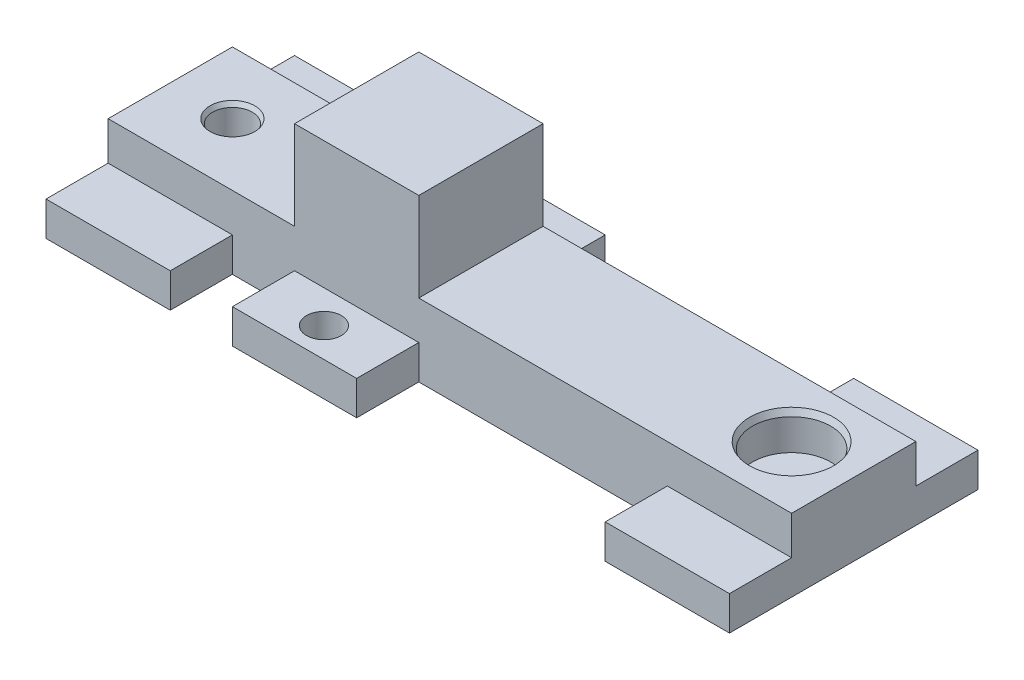
ISO-10303-21;
HEADER;
FILE_DESCRIPTION(('STEP AP214'),'2;1');
FILE_NAME('part.step','',(''),(''),'','','');
FILE_SCHEMA(('AUTOMOTIVE_DESIGN { 1 0 10303 214 1 1 1 1 }'));
ENDSEC;
DATA;
#1=APPLICATION_CONTEXT('core data for automotive mechanical design processes');
#2=APPLICATION_PROTOCOL_DEFINITION('international standard','automotive_design',2000,#1);
#3=PRODUCT_CONTEXT('',#1,'mechanical');
#4=PRODUCT('Part','Part','',(#3));
#5=PRODUCT_RELATED_PRODUCT_CATEGORY('part','',(#4));
#6=PRODUCT_DEFINITION_FORMATION('','',#4);
#7=PRODUCT_DEFINITION_CONTEXT('part definition',#1,'design');
#8=PRODUCT_DEFINITION('design','',#6,#7);
#9=PRODUCT_DEFINITION_SHAPE('','',#8);
#10=(LENGTH_UNIT() NAMED_UNIT(*) SI_UNIT(.MILLI.,.METRE.));
#11=(NAMED_UNIT(*) PLANE_ANGLE_UNIT() SI_UNIT($,.RADIAN.));
#12=(NAMED_UNIT(*) SI_UNIT($,.STERADIAN.) SOLID_ANGLE_UNIT());
#13=UNCERTAINTY_MEASURE_WITH_UNIT(LENGTH_MEASURE(1.E-05),#10,'distance_accuracy_value','');
#14=(GEOMETRIC_REPRESENTATION_CONTEXT(3) GLOBAL_UNCERTAINTY_ASSIGNED_CONTEXT((#13)) GLOBAL_UNIT_ASSIGNED_CONTEXT((#10,
#11,#12)) REPRESENTATION_CONTEXT('',''));
#15=CARTESIAN_POINT('',(0.,0.,0.));
#16=DIRECTION('',(0.,0.,1.));
#17=DIRECTION('',(1.,0.,0.));
#18=AXIS2_PLACEMENT_3D('',#15,#16,#17);
#19=CARTESIAN_POINT('',(0.,-6.5,0.));
#20=DIRECTION('',(0.,1.,0.));
#21=DIRECTION('',(0.,0.,1.));
#22=AXIS2_PLACEMENT_3D('',#19,#20,#21);
#23=PLANE('',#22);
#24=CARTESIAN_POINT('',(-15.,-6.5,0.));
#25=DIRECTION('',(0.,1.,0.));
#26=DIRECTION('',(0.,0.,1.));
#27=AXIS2_PLACEMENT_3D('',#24,#25,#26);
#28=CIRCLE('',#27,1.8);
#29=CARTESIAN_POINT('',(-15.,-6.5,1.8));
#30=VERTEX_POINT('',#29);
#31=EDGE_CURVE('E383',#30,#30,#28,.T.);
#32=ORIENTED_EDGE('',*,*,#31,.T.);
#33=EDGE_LOOP('',(#32));
#34=FACE_BOUND('',#33,.T.);
#35=CARTESIAN_POINT('',(0.,-6.5,7.63675200643376));
#36=DIRECTION('',(0.,1.,0.));
#37=DIRECTION('',(0.,0.,1.));
#38=AXIS2_PLACEMENT_3D('',#35,#36,#37);
#39=CIRCLE('',#38,1.6);
#40=CARTESIAN_POINT('',(0.,-6.5,9.23675200643376));
#41=VERTEX_POINT('',#40);
#42=EDGE_CURVE('E379',#41,#41,#39,.T.);
#43=ORIENTED_EDGE('',*,*,#42,.T.);
#44=EDGE_LOOP('',(#43));
#45=FACE_BOUND('',#44,.T.);
#46=CARTESIAN_POINT('',(0.,-6.5,-7.63675200643376));
#47=DIRECTION('',(0.,1.,0.));
#48=DIRECTION('',(0.,0.,1.));
#49=AXIS2_PLACEMENT_3D('',#46,#47,#48);
#50=CIRCLE('',#49,1.74641016151377);
#51=CARTESIAN_POINT('',(0.,-6.5,-5.89034184491999));
#52=VERTEX_POINT('',#51);
#53=EDGE_CURVE('E375',#52,#52,#50,.T.);
#54=ORIENTED_EDGE('',*,*,#53,.T.);
#55=EDGE_LOOP('',(#54));
#56=FACE_BOUND('',#55,.T.);
#57=DIRECTION('',(1.,0.,0.));
#58=VECTOR('',#57,1.);
#59=CARTESIAN_POINT('',(-20.,-6.5,10.));
#60=LINE('',#59,#58);
#61=CARTESIAN_POINT('',(-5.,-6.5,10.));
#62=VERTEX_POINT('',#61);
#63=CARTESIAN_POINT('',(5.,-6.5,10.));
#64=VERTEX_POINT('',#63);
#65=EDGE_CURVE('E244',#62,#64,#60,.T.);
#66=ORIENTED_EDGE('',*,*,#65,.F.);
#67=DIRECTION('',(0.,0.,-1.));
#68=VECTOR('',#67,1.);
#69=CARTESIAN_POINT('',(-5.,-6.5,0.));
#70=LINE('',#69,#68);
#71=CARTESIAN_POINT('',(-5.,-6.5,5.));
#72=VERTEX_POINT('',#71);
#73=EDGE_CURVE('E481',#62,#72,#70,.T.);
#74=ORIENTED_EDGE('',*,*,#73,.T.);
#75=DIRECTION('',(-1.,0.,0.));
#76=VECTOR('',#75,1.);
#77=CARTESIAN_POINT('',(0.,-6.5,5.));
#78=LINE('',#77,#76);
#79=CARTESIAN_POINT('',(-10.,-6.5,5.));
#80=VERTEX_POINT('',#79);
#81=EDGE_CURVE('E602',#72,#80,#78,.T.);
#82=ORIENTED_EDGE('',*,*,#81,.T.);
#83=DIRECTION('',(0.,0.,1.));
#84=VECTOR('',#83,1.);
#85=CARTESIAN_POINT('',(-10.,-6.5,0.));
#86=LINE('',#85,#84);
#87=CARTESIAN_POINT('',(-10.,-6.5,10.));
#88=VERTEX_POINT('',#87);
#89=EDGE_CURVE('E597',#80,#88,#86,.T.);
#90=ORIENTED_EDGE('',*,*,#89,.T.);
#91=CARTESIAN_POINT('',(-20.,-6.5,10.));
#92=VERTEX_POINT('',#91);
#93=EDGE_CURVE('E335',#92,#88,#60,.T.);
#94=ORIENTED_EDGE('',*,*,#93,.F.);
#95=DIRECTION('',(0.,0.,1.));
#96=VECTOR('',#95,1.);
#97=CARTESIAN_POINT('',(-20.,-6.5,-10.));
#98=LINE('',#97,#96);
#99=CARTESIAN_POINT('',(-20.,-6.5,-10.));
#100=VERTEX_POINT('',#99);
#101=EDGE_CURVE('E330',#100,#92,#98,.T.);
#102=ORIENTED_EDGE('',*,*,#101,.F.);
#103=DIRECTION('',(-1.,0.,0.));
#104=VECTOR('',#103,1.);
#105=CARTESIAN_POINT('',(-20.,-6.5,-10.));
#106=LINE('',#105,#104);
#107=CARTESIAN_POINT('',(-10.,-6.5,-10.));
#108=VERTEX_POINT('',#107);
#109=EDGE_CURVE('E343',#108,#100,#106,.T.);
#110=ORIENTED_EDGE('',*,*,#109,.F.);
#111=DIRECTION('',(0.,0.,1.));
#112=VECTOR('',#111,1.);
#113=CARTESIAN_POINT('',(-9.99999999999999,-6.5,0.));
#114=LINE('',#113,#112);
#115=CARTESIAN_POINT('',(-10.,-6.5,-5.));
#116=VERTEX_POINT('',#115);
#117=EDGE_CURVE('E572',#108,#116,#114,.T.);
#118=ORIENTED_EDGE('',*,*,#117,.T.);
#119=DIRECTION('',(1.,0.,0.));
#120=VECTOR('',#119,1.);
#121=CARTESIAN_POINT('',(0.,-6.5,-5.));
#122=LINE('',#121,#120);
#123=CARTESIAN_POINT('',(-5.,-6.5,-5.));
#124=VERTEX_POINT('',#123);
#125=EDGE_CURVE('E576',#116,#124,#122,.T.);
#126=ORIENTED_EDGE('',*,*,#125,.T.);
#127=DIRECTION('',(0.,0.,-1.));
#128=VECTOR('',#127,1.);
#129=CARTESIAN_POINT('',(-5.,-6.5,0.));
#130=LINE('',#129,#128);
#131=CARTESIAN_POINT('',(-5.,-6.5,-10.));
#132=VERTEX_POINT('',#131);
#133=EDGE_CURVE('E569',#124,#132,#130,.T.);
#134=ORIENTED_EDGE('',*,*,#133,.T.);
#135=CARTESIAN_POINT('',(5.,-6.5,-10.));
#136=VERTEX_POINT('',#135);
#137=EDGE_CURVE('E349',#136,#132,#106,.T.);
#138=ORIENTED_EDGE('',*,*,#137,.F.);
#139=DIRECTION('',(0.,0.,1.));
#140=VECTOR('',#139,1.);
#141=CARTESIAN_POINT('',(5.,-6.5,0.));
#142=LINE('',#141,#140);
#143=CARTESIAN_POINT('',(5.,-6.5,-5.));
#144=VERTEX_POINT('',#143);
#145=EDGE_CURVE('E582',#136,#144,#142,.T.);
#146=ORIENTED_EDGE('',*,*,#145,.T.);
#147=DIRECTION('',(1.,0.,0.));
#148=VECTOR('',#147,1.);
#149=CARTESIAN_POINT('',(0.,-6.5,-5.));
#150=LINE('',#149,#148);
#151=CARTESIAN_POINT('',(25.,-6.5,-5.));
#152=VERTEX_POINT('',#151);
#153=EDGE_CURVE('E586',#144,#152,#150,.T.);
#154=ORIENTED_EDGE('',*,*,#153,.T.);
#155=DIRECTION('',(0.,0.,-1.));
#156=VECTOR('',#155,1.);
#157=CARTESIAN_POINT('',(25.,-6.5,0.));
#158=LINE('',#157,#156);
#159=CARTESIAN_POINT('',(25.,-6.5,-10.));
#160=VERTEX_POINT('',#159);
#161=EDGE_CURVE('E500',#152,#160,#158,.T.);
#162=ORIENTED_EDGE('',*,*,#161,.T.);
#163=CARTESIAN_POINT('',(35.,-6.5,-10.));
#164=VERTEX_POINT('',#163);
#165=EDGE_CURVE('E344',#164,#160,#106,.T.);
#166=ORIENTED_EDGE('',*,*,#165,.F.);
#167=DIRECTION('',(0.,0.,-1.));
#168=VECTOR('',#167,1.);
#169=CARTESIAN_POINT('',(35.,-6.5,-10.));
#170=LINE('',#169,#168);
#171=CARTESIAN_POINT('',(35.,-6.5,10.));
#172=VERTEX_POINT('',#171);
#173=EDGE_CURVE('E339',#172,#164,#170,.T.);
#174=ORIENTED_EDGE('',*,*,#173,.F.);
#175=CARTESIAN_POINT('',(25.,-6.5,10.));
#176=VERTEX_POINT('',#175);
#177=EDGE_CURVE('E334',#176,#172,#60,.T.);
#178=ORIENTED_EDGE('',*,*,#177,.F.);
#179=DIRECTION('',(0.,0.,-1.));
#180=VECTOR('',#179,1.);
#181=CARTESIAN_POINT('',(25.,-6.5,0.));
#182=LINE('',#181,#180);
#183=CARTESIAN_POINT('',(25.,-6.5,5.));
#184=VERTEX_POINT('',#183);
#185=EDGE_CURVE('E591',#176,#184,#182,.T.);
#186=ORIENTED_EDGE('',*,*,#185,.T.);
#187=DIRECTION('',(-1.,0.,0.));
#188=VECTOR('',#187,1.);
#189=CARTESIAN_POINT('',(0.,-6.5,5.));
#190=LINE('',#189,#188);
#191=CARTESIAN_POINT('',(5.,-6.5,5.));
#192=VERTEX_POINT('',#191);
#193=EDGE_CURVE('E594',#184,#192,#190,.T.);
#194=ORIENTED_EDGE('',*,*,#193,.T.);
#195=DIRECTION('',(0.,0.,1.));
#196=VECTOR('',#195,1.);
#197=CARTESIAN_POINT('',(5.,-6.5,0.));
#198=LINE('',#197,#196);
#199=EDGE_CURVE('E483',#192,#64,#198,.T.);
#200=ORIENTED_EDGE('',*,*,#199,.T.);
#201=EDGE_LOOP('',(#66,#74,#82,#90,#94,#102,#110,#118,#126,#134,#138,#146,#154,#162,#166,#174,
#178,#186,#194,#200));
#202=FACE_BOUND('',#201,.T.);
#203=ADVANCED_FACE('F40',(#34,#45,#56,#202),#23,.F.);
#204=CARTESIAN_POINT('',(-20.,6.5,10.));
#205=DIRECTION('',(0.,0.,-1.));
#206=DIRECTION('',(-1.,0.,0.));
#207=AXIS2_PLACEMENT_3D('',#204,#205,#206);
#208=PLANE('',#207);
#209=DIRECTION('',(1.,0.,0.));
#210=VECTOR('',#209,1.);
#211=CARTESIAN_POINT('',(35.,-3.75,10.));
#212=LINE('',#211,#210);
#213=CARTESIAN_POINT('',(-5.,-3.75,10.));
#214=VERTEX_POINT('',#213);
#215=CARTESIAN_POINT('',(5.,-3.75,10.));
#216=VERTEX_POINT('',#215);
#217=EDGE_CURVE('E242',#214,#216,#212,.T.);
#218=ORIENTED_EDGE('',*,*,#217,.F.);
#219=DIRECTION('',(0.,1.,0.));
#220=VECTOR('',#219,1.);
#221=CARTESIAN_POINT('',(-5.,-6.75,10.));
#222=LINE('',#221,#220);
#223=EDGE_CURVE('E648',#62,#214,#222,.T.);
#224=ORIENTED_EDGE('',*,*,#223,.F.);
#225=ORIENTED_EDGE('',*,*,#65,.T.);
#226=DIRECTION('',(0.,1.,0.));
#227=VECTOR('',#226,1.);
#228=CARTESIAN_POINT('',(5.,-6.75,10.));
#229=LINE('',#228,#227);
#230=EDGE_CURVE('E227',#64,#216,#229,.T.);
#231=ORIENTED_EDGE('',*,*,#230,.T.);
#232=EDGE_LOOP('',(#218,#224,#225,#231));
#233=FACE_BOUND('',#232,.T.);
#234=ADVANCED_FACE('F240',(#233),#208,.F.);
#235=CARTESIAN_POINT('',(25.,-3.75,10.));
#236=VERTEX_POINT('',#235);
#237=CARTESIAN_POINT('',(35.,-3.75,10.));
#238=VERTEX_POINT('',#237);
#239=EDGE_CURVE('E254',#236,#238,#212,.T.);
#240=ORIENTED_EDGE('',*,*,#239,.F.);
#241=DIRECTION('',(0.,1.,0.));
#242=VECTOR('',#241,1.);
#243=CARTESIAN_POINT('',(25.,-6.75,10.));
#244=LINE('',#243,#242);
#245=EDGE_CURVE('E246',#176,#236,#244,.T.);
#246=ORIENTED_EDGE('',*,*,#245,.F.);
#247=ORIENTED_EDGE('',*,*,#177,.T.);
#248=DIRECTION('',(0.,-1.,0.));
#249=VECTOR('',#248,1.);
#250=CARTESIAN_POINT('',(35.,6.5,10.));
#251=LINE('',#250,#249);
#252=EDGE_CURVE('E356',#238,#172,#251,.T.);
#253=ORIENTED_EDGE('',*,*,#252,.F.);
#254=EDGE_LOOP('',(#240,#246,#247,#253));
#255=FACE_BOUND('',#254,.T.);
#256=ADVANCED_FACE('F416',(#255),#208,.F.);
#257=CARTESIAN_POINT('',(-20.,6.5,-10.));
#258=DIRECTION('',(0.,0.,1.));
#259=DIRECTION('',(1.,0.,0.));
#260=AXIS2_PLACEMENT_3D('',#257,#258,#259);
#261=PLANE('',#260);
#262=DIRECTION('',(-1.,0.,0.));
#263=VECTOR('',#262,1.);
#264=CARTESIAN_POINT('',(-20.,-3.75,-10.));
#265=LINE('',#264,#263);
#266=CARTESIAN_POINT('',(5.,-3.75,-10.));
#267=VERTEX_POINT('',#266);
#268=CARTESIAN_POINT('',(-5.,-3.75,-10.));
#269=VERTEX_POINT('',#268);
#270=EDGE_CURVE('E518',#267,#269,#265,.T.);
#271=ORIENTED_EDGE('',*,*,#270,.F.);
#272=DIRECTION('',(0.,1.,0.));
#273=VECTOR('',#272,1.);
#274=CARTESIAN_POINT('',(5.,-6.75,-10.));
#275=LINE('',#274,#273);
#276=EDGE_CURVE('E552',#136,#267,#275,.T.);
#277=ORIENTED_EDGE('',*,*,#276,.F.);
#278=ORIENTED_EDGE('',*,*,#137,.T.);
#279=DIRECTION('',(0.,1.,0.));
#280=VECTOR('',#279,1.);
#281=CARTESIAN_POINT('',(-5.,-6.75,-10.));
#282=LINE('',#281,#280);
#283=EDGE_CURVE('E554',#132,#269,#282,.T.);
#284=ORIENTED_EDGE('',*,*,#283,.T.);
#285=EDGE_LOOP('',(#271,#277,#278,#284));
#286=FACE_BOUND('',#285,.T.);
#287=ADVANCED_FACE('F430',(#286),#261,.F.);
#288=CARTESIAN_POINT('',(-10.,-3.75,-10.));
#289=VERTEX_POINT('',#288);
#290=CARTESIAN_POINT('',(-20.,-3.75,-10.));
#291=VERTEX_POINT('',#290);
#292=EDGE_CURVE('E513',#289,#291,#265,.T.);
#293=ORIENTED_EDGE('',*,*,#292,.F.);
#294=DIRECTION('',(0.,1.,0.));
#295=VECTOR('',#294,1.);
#296=CARTESIAN_POINT('',(-10.,-6.75,-10.));
#297=LINE('',#296,#295);
#298=EDGE_CURVE('E558',#108,#289,#297,.T.);
#299=ORIENTED_EDGE('',*,*,#298,.F.);
#300=ORIENTED_EDGE('',*,*,#109,.T.);
#301=DIRECTION('',(0.,-1.,0.));
#302=VECTOR('',#301,1.);
#303=CARTESIAN_POINT('',(-20.,6.5,-10.));
#304=LINE('',#303,#302);
#305=EDGE_CURVE('E348',#291,#100,#304,.T.);
#306=ORIENTED_EDGE('',*,*,#305,.F.);
#307=EDGE_LOOP('',(#293,#299,#300,#306));
#308=FACE_BOUND('',#307,.T.);
#309=ADVANCED_FACE('F431',(#308),#261,.F.);
#310=CARTESIAN_POINT('',(0.,-3.75,0.));
#311=DIRECTION('',(0.,-1.,0.));
#312=DIRECTION('',(0.,0.,-1.));
#313=AXIS2_PLACEMENT_3D('',#310,#311,#312);
#314=PLANE('',#313);
#315=CARTESIAN_POINT('',(0.,-3.75,7.63675200643376));
#316=DIRECTION('',(0.,-1.,0.));
#317=DIRECTION('',(0.,0.,-1.));
#318=AXIS2_PLACEMENT_3D('',#315,#316,#317);
#319=CIRCLE('',#318,1.4);
#320=CARTESIAN_POINT('',(0.,-3.75,6.23675200643376));
#321=VERTEX_POINT('',#320);
#322=EDGE_CURVE('E235',#321,#321,#319,.T.);
#323=ORIENTED_EDGE('',*,*,#322,.T.);
#324=EDGE_LOOP('',(#323));
#325=FACE_BOUND('',#324,.T.);
#326=DIRECTION('',(-1.,0.,0.));
#327=VECTOR('',#326,1.);
#328=CARTESIAN_POINT('',(-20.,-3.75,5.));
#329=LINE('',#328,#327);
#330=CARTESIAN_POINT('',(5.,-3.75,5.));
#331=VERTEX_POINT('',#330);
#332=CARTESIAN_POINT('',(-5.,-3.75,5.));
#333=VERTEX_POINT('',#332);
#334=EDGE_CURVE('E272',#331,#333,#329,.T.);
#335=ORIENTED_EDGE('',*,*,#334,.T.);
#336=DIRECTION('',(0.,0.,-1.));
#337=VECTOR('',#336,1.);
#338=CARTESIAN_POINT('',(-5.,-3.75,5.));
#339=LINE('',#338,#337);
#340=EDGE_CURVE('E251',#214,#333,#339,.T.);
#341=ORIENTED_EDGE('',*,*,#340,.F.);
#342=ORIENTED_EDGE('',*,*,#217,.T.);
#343=DIRECTION('',(0.,0.,1.));
#344=VECTOR('',#343,1.);
#345=CARTESIAN_POINT('',(5.,-3.75,5.));
#346=LINE('',#345,#344);
#347=EDGE_CURVE('E224',#331,#216,#346,.T.);
#348=ORIENTED_EDGE('',*,*,#347,.F.);
#349=EDGE_LOOP('',(#335,#341,#342,#348));
#350=FACE_BOUND('',#349,.T.);
#351=ADVANCED_FACE('F249',(#325,#350),#314,.F.);
#352=CARTESIAN_POINT('',(35.,-3.75,5.));
#353=VERTEX_POINT('',#352);
#354=CARTESIAN_POINT('',(25.,-3.75,5.));
#355=VERTEX_POINT('',#354);
#356=EDGE_CURVE('E267',#353,#355,#329,.T.);
#357=ORIENTED_EDGE('',*,*,#356,.T.);
#358=DIRECTION('',(0.,0.,-1.));
#359=VECTOR('',#358,1.);
#360=CARTESIAN_POINT('',(25.,-3.75,10.));
#361=LINE('',#360,#359);
#362=EDGE_CURVE('E234',#236,#355,#361,.T.);
#363=ORIENTED_EDGE('',*,*,#362,.F.);
#364=ORIENTED_EDGE('',*,*,#239,.T.);
#365=DIRECTION('',(0.,0.,-1.));
#366=VECTOR('',#365,1.);
#367=CARTESIAN_POINT('',(35.,-3.75,5.));
#368=LINE('',#367,#366);
#369=EDGE_CURVE('E259',#238,#353,#368,.T.);
#370=ORIENTED_EDGE('',*,*,#369,.T.);
#371=EDGE_LOOP('',(#357,#363,#364,#370));
#372=FACE_BOUND('',#371,.T.);
#373=ADVANCED_FACE('F769',(#372),#314,.F.);
#374=CARTESIAN_POINT('',(0.,-3.75,0.));
#375=DIRECTION('',(0.,-1.,0.));
#376=DIRECTION('',(0.,0.,-1.));
#377=AXIS2_PLACEMENT_3D('',#374,#375,#376);
#378=PLANE('',#377);
#379=CARTESIAN_POINT('',(0.,-3.75,-7.63675200643376));
#380=DIRECTION('',(0.,1.,0.));
#381=DIRECTION('',(0.,0.,1.));
#382=AXIS2_PLACEMENT_3D('',#379,#380,#381);
#383=CIRCLE('',#382,1.4);
#384=CARTESIAN_POINT('',(0.,-3.75,-6.23675200643376));
#385=VERTEX_POINT('',#384);
#386=EDGE_CURVE('E715',#385,#385,#383,.T.);
#387=ORIENTED_EDGE('',*,*,#386,.F.);
#388=EDGE_LOOP('',(#387));
#389=FACE_BOUND('',#388,.T.);
#390=DIRECTION('',(1.,0.,0.));
#391=VECTOR('',#390,1.);
#392=CARTESIAN_POINT('',(35.,-3.75,-5.));
#393=LINE('',#392,#391);
#394=CARTESIAN_POINT('',(-5.,-3.75,-5.));
#395=VERTEX_POINT('',#394);
#396=CARTESIAN_POINT('',(5.,-3.75,-5.));
#397=VERTEX_POINT('',#396);
#398=EDGE_CURVE('E521',#395,#397,#393,.T.);
#399=ORIENTED_EDGE('',*,*,#398,.T.);
#400=DIRECTION('',(0.,0.,1.));
#401=VECTOR('',#400,1.);
#402=CARTESIAN_POINT('',(5.,-3.75,-5.));
#403=LINE('',#402,#401);
#404=EDGE_CURVE('E547',#267,#397,#403,.T.);
#405=ORIENTED_EDGE('',*,*,#404,.F.);
#406=ORIENTED_EDGE('',*,*,#270,.T.);
#407=DIRECTION('',(0.,0.,-1.));
#408=VECTOR('',#407,1.);
#409=CARTESIAN_POINT('',(-5.,-3.75,-5.));
#410=LINE('',#409,#408);
#411=EDGE_CURVE('E544',#395,#269,#410,.T.);
#412=ORIENTED_EDGE('',*,*,#411,.F.);
#413=EDGE_LOOP('',(#399,#405,#406,#412));
#414=FACE_BOUND('',#413,.T.);
#415=ADVANCED_FACE('F543',(#389,#414),#378,.F.);
#416=CARTESIAN_POINT('',(-20.,-3.75,-5.));
#417=VERTEX_POINT('',#416);
#418=CARTESIAN_POINT('',(-10.,-3.75,-5.));
#419=VERTEX_POINT('',#418);
#420=EDGE_CURVE('E514',#417,#419,#393,.T.);
#421=ORIENTED_EDGE('',*,*,#420,.T.);
#422=DIRECTION('',(0.,0.,1.));
#423=VECTOR('',#422,1.);
#424=CARTESIAN_POINT('',(-10.,-3.75,-5.));
#425=LINE('',#424,#423);
#426=EDGE_CURVE('E565',#289,#419,#425,.T.);
#427=ORIENTED_EDGE('',*,*,#426,.F.);
#428=ORIENTED_EDGE('',*,*,#292,.T.);
#429=DIRECTION('',(0.,0.,1.));
#430=VECTOR('',#429,1.);
#431=CARTESIAN_POINT('',(-20.,-3.75,-5.));
#432=LINE('',#431,#430);
#433=EDGE_CURVE('E527',#291,#417,#432,.T.);
#434=ORIENTED_EDGE('',*,*,#433,.T.);
#435=EDGE_LOOP('',(#421,#427,#428,#434));
#436=FACE_BOUND('',#435,.T.);
#437=ADVANCED_FACE('F683',(#436),#378,.F.);
#438=CARTESIAN_POINT('',(0.,-0.65,0.));
#439=DIRECTION('',(0.,1.,0.));
#440=DIRECTION('',(0.,0.,1.));
#441=AXIS2_PLACEMENT_3D('',#438,#439,#440);
#442=PLANE('',#441);
#443=CARTESIAN_POINT('',(-15.,-0.65,0.));
#444=DIRECTION('',(0.,1.,0.));
#445=DIRECTION('',(0.,0.,1.));
#446=AXIS2_PLACEMENT_3D('',#443,#444,#445);
#447=CIRCLE('',#446,1.8);
#448=CARTESIAN_POINT('',(-15.,-0.65,1.8));
#449=VERTEX_POINT('',#448);
#450=EDGE_CURVE('E371',#449,#449,#447,.F.);
#451=ORIENTED_EDGE('',*,*,#450,.T.);
#452=EDGE_LOOP('',(#451));
#453=FACE_BOUND('',#452,.T.);
#454=DIRECTION('',(1.,0.,0.));
#455=VECTOR('',#454,1.);
#456=CARTESIAN_POINT('',(-5.,-0.65,-5.));
#457=LINE('',#456,#455);
#458=CARTESIAN_POINT('',(-20.,-0.65,-5.));
#459=VERTEX_POINT('',#458);
#460=CARTESIAN_POINT('',(-5.,-0.65,-5.));
#461=VERTEX_POINT('',#460);
#462=EDGE_CURVE('E531',#459,#461,#457,.T.);
#463=ORIENTED_EDGE('',*,*,#462,.F.);
#464=DIRECTION('',(0.,0.,1.));
#465=VECTOR('',#464,1.);
#466=CARTESIAN_POINT('',(-20.,-0.65,10.));
#467=LINE('',#466,#465);
#468=CARTESIAN_POINT('',(-20.,-0.65,5.));
#469=VERTEX_POINT('',#468);
#470=EDGE_CURVE('E313',#459,#469,#467,.T.);
#471=ORIENTED_EDGE('',*,*,#470,.T.);
#472=DIRECTION('',(-1.,0.,0.));
#473=VECTOR('',#472,1.);
#474=CARTESIAN_POINT('',(-20.,-0.65,5.));
#475=LINE('',#474,#473);
#476=CARTESIAN_POINT('',(-5.,-0.65,5.));
#477=VERTEX_POINT('',#476);
#478=EDGE_CURVE('E276',#477,#469,#475,.T.);
#479=ORIENTED_EDGE('',*,*,#478,.F.);
#480=DIRECTION('',(0.,0.,1.));
#481=VECTOR('',#480,1.);
#482=CARTESIAN_POINT('',(-5.,-0.65,-5.));
#483=LINE('',#482,#481);
#484=EDGE_CURVE('E284',#461,#477,#483,.T.);
#485=ORIENTED_EDGE('',*,*,#484,.F.);
#486=EDGE_LOOP('',(#463,#471,#479,#485));
#487=FACE_BOUND('',#486,.T.);
#488=ADVANCED_FACE('F440',(#453,#487),#442,.T.);
#489=CARTESIAN_POINT('',(-20.,6.5,-10.));
#490=DIRECTION('',(1.,0.,0.));
#491=DIRECTION('',(0.,0.,-1.));
#492=AXIS2_PLACEMENT_3D('',#489,#490,#491);
#493=PLANE('',#492);
#494=ORIENTED_EDGE('',*,*,#470,.F.);
#495=DIRECTION('',(0.,1.,0.));
#496=VECTOR('',#495,1.);
#497=CARTESIAN_POINT('',(-20.,-3.75,-5.));
#498=LINE('',#497,#496);
#499=EDGE_CURVE('E299',#417,#459,#498,.T.);
#500=ORIENTED_EDGE('',*,*,#499,.F.);
#501=ORIENTED_EDGE('',*,*,#433,.F.);
#502=ORIENTED_EDGE('',*,*,#305,.T.);
#503=ORIENTED_EDGE('',*,*,#101,.T.);
#504=DIRECTION('',(0.,-1.,0.));
#505=VECTOR('',#504,1.);
#506=CARTESIAN_POINT('',(-20.,6.5,10.));
#507=LINE('',#506,#505);
#508=CARTESIAN_POINT('',(-20.,-3.75,10.));
#509=VERTEX_POINT('',#508);
#510=EDGE_CURVE('E360',#509,#92,#507,.T.);
#511=ORIENTED_EDGE('',*,*,#510,.F.);
#512=DIRECTION('',(0.,0.,1.));
#513=VECTOR('',#512,1.);
#514=CARTESIAN_POINT('',(-20.,-3.75,10.));
#515=LINE('',#514,#513);
#516=CARTESIAN_POINT('',(-20.,-3.75,5.));
#517=VERTEX_POINT('',#516);
#518=EDGE_CURVE('E260',#517,#509,#515,.T.);
#519=ORIENTED_EDGE('',*,*,#518,.F.);
#520=DIRECTION('',(0.,1.,0.));
#521=VECTOR('',#520,1.);
#522=CARTESIAN_POINT('',(-20.,-3.75,5.));
#523=LINE('',#522,#521);
#524=EDGE_CURVE('E277',#517,#469,#523,.T.);
#525=ORIENTED_EDGE('',*,*,#524,.T.);
#526=EDGE_LOOP('',(#494,#500,#501,#502,#503,#511,#519,#525));
#527=FACE_BOUND('',#526,.T.);
#528=ADVANCED_FACE('F436',(#527),#493,.F.);
#529=ORIENTED_EDGE('',*,*,#93,.T.);
#530=DIRECTION('',(0.,1.,0.));
#531=VECTOR('',#530,1.);
#532=CARTESIAN_POINT('',(-10.,-6.75,10.));
#533=LINE('',#532,#531);
#534=CARTESIAN_POINT('',(-10.,-3.75,10.));
#535=VERTEX_POINT('',#534);
#536=EDGE_CURVE('E643',#88,#535,#533,.T.);
#537=ORIENTED_EDGE('',*,*,#536,.T.);
#538=EDGE_CURVE('E253',#509,#535,#212,.T.);
#539=ORIENTED_EDGE('',*,*,#538,.F.);
#540=ORIENTED_EDGE('',*,*,#510,.T.);
#541=EDGE_LOOP('',(#529,#537,#539,#540));
#542=FACE_BOUND('',#541,.T.);
#543=ADVANCED_FACE('F418',(#542),#208,.F.);
#544=CARTESIAN_POINT('',(35.,6.5,-10.));
#545=DIRECTION('',(-1.,0.,0.));
#546=DIRECTION('',(0.,0.,1.));
#547=AXIS2_PLACEMENT_3D('',#544,#545,#546);
#548=PLANE('',#547);
#549=DIRECTION('',(0.,0.,-1.));
#550=VECTOR('',#549,1.);
#551=CARTESIAN_POINT('',(35.,-3.75,-10.));
#552=LINE('',#551,#550);
#553=CARTESIAN_POINT('',(35.,-3.75,-5.));
#554=VERTEX_POINT('',#553);
#555=CARTESIAN_POINT('',(35.,-3.75,-10.));
#556=VERTEX_POINT('',#555);
#557=EDGE_CURVE('E507',#554,#556,#552,.T.);
#558=ORIENTED_EDGE('',*,*,#557,.F.);
#559=DIRECTION('',(0.,1.,0.));
#560=VECTOR('',#559,1.);
#561=CARTESIAN_POINT('',(35.,-3.75,-5.));
#562=LINE('',#561,#560);
#563=CARTESIAN_POINT('',(35.,-0.65,-5.));
#564=VERTEX_POINT('',#563);
#565=EDGE_CURVE('E510',#554,#564,#562,.T.);
#566=ORIENTED_EDGE('',*,*,#565,.T.);
#567=DIRECTION('',(0.,0.,-1.));
#568=VECTOR('',#567,1.);
#569=CARTESIAN_POINT('',(35.,-0.65,10.));
#570=LINE('',#569,#568);
#571=CARTESIAN_POINT('',(35.,-0.65,5.));
#572=VERTEX_POINT('',#571);
#573=EDGE_CURVE('E326',#572,#564,#570,.T.);
#574=ORIENTED_EDGE('',*,*,#573,.F.);
#575=DIRECTION('',(0.,1.,0.));
#576=VECTOR('',#575,1.);
#577=CARTESIAN_POINT('',(35.,-3.75,5.));
#578=LINE('',#577,#576);
#579=EDGE_CURVE('E271',#353,#572,#578,.T.);
#580=ORIENTED_EDGE('',*,*,#579,.F.);
#581=ORIENTED_EDGE('',*,*,#369,.F.);
#582=ORIENTED_EDGE('',*,*,#252,.T.);
#583=ORIENTED_EDGE('',*,*,#173,.T.);
#584=DIRECTION('',(0.,-1.,0.));
#585=VECTOR('',#584,1.);
#586=CARTESIAN_POINT('',(35.,6.5,-10.));
#587=LINE('',#586,#585);
#588=EDGE_CURVE('E353',#556,#164,#587,.T.);
#589=ORIENTED_EDGE('',*,*,#588,.F.);
#590=EDGE_LOOP('',(#558,#566,#574,#580,#581,#582,#583,#589));
#591=FACE_BOUND('',#590,.T.);
#592=ADVANCED_FACE('F428',(#591),#548,.F.);
#593=ORIENTED_EDGE('',*,*,#165,.T.);
#594=DIRECTION('',(0.,1.,0.));
#595=VECTOR('',#594,1.);
#596=CARTESIAN_POINT('',(25.,-6.75,-10.));
#597=LINE('',#596,#595);
#598=CARTESIAN_POINT('',(25.,-3.75,-10.));
#599=VERTEX_POINT('',#598);
#600=EDGE_CURVE('E503',#160,#599,#597,.T.);
#601=ORIENTED_EDGE('',*,*,#600,.T.);
#602=EDGE_CURVE('E505',#556,#599,#265,.T.);
#603=ORIENTED_EDGE('',*,*,#602,.F.);
#604=ORIENTED_EDGE('',*,*,#588,.T.);
#605=EDGE_LOOP('',(#593,#601,#603,#604));
#606=FACE_BOUND('',#605,.T.);
#607=ADVANCED_FACE('F424',(#606),#261,.F.);
#608=CARTESIAN_POINT('',(30.,-0.65,0.));
#609=DIRECTION('',(0.,1.,0.));
#610=DIRECTION('',(0.,0.,1.));
#611=AXIS2_PLACEMENT_3D('',#608,#609,#610);
#612=CIRCLE('',#611,3.38315382907749);
#613=CARTESIAN_POINT('',(30.,-0.65,3.38315382907749));
#614=VERTEX_POINT('',#613);
#615=EDGE_CURVE('E11',#614,#614,#612,.F.);
#616=ORIENTED_EDGE('',*,*,#615,.T.);
#617=EDGE_LOOP('',(#616));
#618=FACE_BOUND('',#617,.T.);
#619=CARTESIAN_POINT('',(5.,-0.65,-5.));
#620=VERTEX_POINT('',#619);
#621=EDGE_CURVE('E281',#620,#564,#457,.T.);
#622=ORIENTED_EDGE('',*,*,#621,.F.);
#623=DIRECTION('',(0.,0.,-1.));
#624=VECTOR('',#623,1.);
#625=CARTESIAN_POINT('',(5.,-0.65,-5.));
#626=LINE('',#625,#624);
#627=CARTESIAN_POINT('',(5.,-0.65,5.));
#628=VERTEX_POINT('',#627);
#629=EDGE_CURVE('E288',#628,#620,#626,.T.);
#630=ORIENTED_EDGE('',*,*,#629,.F.);
#631=EDGE_CURVE('E273',#572,#628,#475,.T.);
#632=ORIENTED_EDGE('',*,*,#631,.F.);
#633=ORIENTED_EDGE('',*,*,#573,.T.);
#634=EDGE_LOOP('',(#622,#630,#632,#633));
#635=FACE_BOUND('',#634,.T.);
#636=ADVANCED_FACE('F427',(#618,#635),#442,.T.);
#637=CARTESIAN_POINT('',(-5.,-0.65,-5.));
#638=DIRECTION('',(-1.,0.,0.));
#639=DIRECTION('',(0.,0.,1.));
#640=AXIS2_PLACEMENT_3D('',#637,#638,#639);
#641=PLANE('',#640);
#642=DIRECTION('',(0.,0.,1.));
#643=VECTOR('',#642,1.);
#644=CARTESIAN_POINT('',(-5.,6.5,-5.));
#645=LINE('',#644,#643);
#646=CARTESIAN_POINT('',(-5.,6.5,-5.));
#647=VERTEX_POINT('',#646);
#648=CARTESIAN_POINT('',(-5.,6.5,5.));
#649=VERTEX_POINT('',#648);
#650=EDGE_CURVE('E294',#647,#649,#645,.T.);
#651=ORIENTED_EDGE('',*,*,#650,.F.);
#652=DIRECTION('',(0.,1.,0.));
#653=VECTOR('',#652,1.);
#654=CARTESIAN_POINT('',(-5.,-0.65,-5.));
#655=LINE('',#654,#653);
#656=EDGE_CURVE('E310',#461,#647,#655,.T.);
#657=ORIENTED_EDGE('',*,*,#656,.F.);
#658=ORIENTED_EDGE('',*,*,#484,.T.);
#659=DIRECTION('',(0.,1.,0.));
#660=VECTOR('',#659,1.);
#661=CARTESIAN_POINT('',(-5.,-0.65,5.));
#662=LINE('',#661,#660);
#663=EDGE_CURVE('E293',#477,#649,#662,.T.);
#664=ORIENTED_EDGE('',*,*,#663,.T.);
#665=EDGE_LOOP('',(#651,#657,#658,#664));
#666=FACE_BOUND('',#665,.T.);
#667=ADVANCED_FACE('F624',(#666),#641,.T.);
#668=CARTESIAN_POINT('',(-5.,-0.65,-5.));
#669=DIRECTION('',(0.,0.,-1.));
#670=DIRECTION('',(-1.,0.,0.));
#671=AXIS2_PLACEMENT_3D('',#668,#669,#670);
#672=PLANE('',#671);
#673=DIRECTION('',(-1.,0.,0.));
#674=VECTOR('',#673,1.);
#675=CARTESIAN_POINT('',(-5.,6.5,-5.));
#676=LINE('',#675,#674);
#677=CARTESIAN_POINT('',(5.,6.5,-5.));
#678=VERTEX_POINT('',#677);
#679=EDGE_CURVE('E289',#678,#647,#676,.T.);
#680=ORIENTED_EDGE('',*,*,#679,.F.);
#681=DIRECTION('',(0.,1.,0.));
#682=VECTOR('',#681,1.);
#683=CARTESIAN_POINT('',(5.,-0.65,-5.));
#684=LINE('',#683,#682);
#685=EDGE_CURVE('E314',#620,#678,#684,.T.);
#686=ORIENTED_EDGE('',*,*,#685,.F.);
#687=ORIENTED_EDGE('',*,*,#621,.T.);
#688=ORIENTED_EDGE('',*,*,#565,.F.);
#689=CARTESIAN_POINT('',(25.,-3.75,-5.));
#690=VERTEX_POINT('',#689);
#691=EDGE_CURVE('E523',#690,#554,#393,.T.);
#692=ORIENTED_EDGE('',*,*,#691,.F.);
#693=DIRECTION('',(0.,1.,0.));
#694=VECTOR('',#693,1.);
#695=CARTESIAN_POINT('',(25.,-6.75,-5.));
#696=LINE('',#695,#694);
#697=EDGE_CURVE('E659',#152,#690,#696,.T.);
#698=ORIENTED_EDGE('',*,*,#697,.F.);
#699=ORIENTED_EDGE('',*,*,#153,.F.);
#700=DIRECTION('',(0.,1.,0.));
#701=VECTOR('',#700,1.);
#702=CARTESIAN_POINT('',(5.,-6.75,-5.));
#703=LINE('',#702,#701);
#704=EDGE_CURVE('E660',#144,#397,#703,.T.);
#705=ORIENTED_EDGE('',*,*,#704,.T.);
#706=ORIENTED_EDGE('',*,*,#398,.F.);
#707=DIRECTION('',(0.,1.,0.));
#708=VECTOR('',#707,1.);
#709=CARTESIAN_POINT('',(-5.,-6.75,-5.));
#710=LINE('',#709,#708);
#711=EDGE_CURVE('E559',#124,#395,#710,.T.);
#712=ORIENTED_EDGE('',*,*,#711,.F.);
#713=ORIENTED_EDGE('',*,*,#125,.F.);
#714=DIRECTION('',(0.,1.,0.));
#715=VECTOR('',#714,1.);
#716=CARTESIAN_POINT('',(-10.,-6.75,-5.));
#717=LINE('',#716,#715);
#718=EDGE_CURVE('E563',#116,#419,#717,.T.);
#719=ORIENTED_EDGE('',*,*,#718,.T.);
#720=ORIENTED_EDGE('',*,*,#420,.F.);
#721=ORIENTED_EDGE('',*,*,#499,.T.);
#722=ORIENTED_EDGE('',*,*,#462,.T.);
#723=ORIENTED_EDGE('',*,*,#656,.T.);
#724=EDGE_LOOP('',(#680,#686,#687,#688,#692,#698,#699,#705,#706,#712,#713,#719,#720,#721,#722,#723));
#725=FACE_BOUND('',#724,.T.);
#726=ADVANCED_FACE('F621',(#725),#672,.T.);
#727=CARTESIAN_POINT('',(5.,-0.65,-5.));
#728=DIRECTION('',(1.,0.,0.));
#729=DIRECTION('',(0.,0.,-1.));
#730=AXIS2_PLACEMENT_3D('',#727,#728,#729);
#731=PLANE('',#730);
#732=DIRECTION('',(0.,0.,-1.));
#733=VECTOR('',#732,1.);
#734=CARTESIAN_POINT('',(5.,6.5,-5.));
#735=LINE('',#734,#733);
#736=CARTESIAN_POINT('',(5.,6.5,5.));
#737=VERTEX_POINT('',#736);
#738=EDGE_CURVE('E303',#737,#678,#735,.T.);
#739=ORIENTED_EDGE('',*,*,#738,.F.);
#740=DIRECTION('',(0.,1.,0.));
#741=VECTOR('',#740,1.);
#742=CARTESIAN_POINT('',(5.,-0.65,5.));
#743=LINE('',#742,#741);
#744=EDGE_CURVE('E317',#628,#737,#743,.T.);
#745=ORIENTED_EDGE('',*,*,#744,.F.);
#746=ORIENTED_EDGE('',*,*,#629,.T.);
#747=ORIENTED_EDGE('',*,*,#685,.T.);
#748=EDGE_LOOP('',(#739,#745,#746,#747));
#749=FACE_BOUND('',#748,.T.);
#750=ADVANCED_FACE('F630',(#749),#731,.T.);
#751=CARTESIAN_POINT('',(-5.,-0.65,5.));
#752=DIRECTION('',(0.,0.,1.));
#753=DIRECTION('',(1.,0.,0.));
#754=AXIS2_PLACEMENT_3D('',#751,#752,#753);
#755=PLANE('',#754);
#756=DIRECTION('',(1.,0.,0.));
#757=VECTOR('',#756,1.);
#758=CARTESIAN_POINT('',(-5.,6.5,5.));
#759=LINE('',#758,#757);
#760=EDGE_CURVE('E298',#649,#737,#759,.T.);
#761=ORIENTED_EDGE('',*,*,#760,.F.);
#762=ORIENTED_EDGE('',*,*,#663,.F.);
#763=ORIENTED_EDGE('',*,*,#478,.T.);
#764=ORIENTED_EDGE('',*,*,#524,.F.);
#765=CARTESIAN_POINT('',(-10.,-3.75,5.));
#766=VERTEX_POINT('',#765);
#767=EDGE_CURVE('E266',#766,#517,#329,.T.);
#768=ORIENTED_EDGE('',*,*,#767,.F.);
#769=DIRECTION('',(0.,1.,0.));
#770=VECTOR('',#769,1.);
#771=CARTESIAN_POINT('',(-10.,-6.75,5.));
#772=LINE('',#771,#770);
#773=EDGE_CURVE('E57',#80,#766,#772,.T.);
#774=ORIENTED_EDGE('',*,*,#773,.F.);
#775=ORIENTED_EDGE('',*,*,#81,.F.);
#776=DIRECTION('',(0.,1.,0.));
#777=VECTOR('',#776,1.);
#778=CARTESIAN_POINT('',(-5.,-6.75,5.));
#779=LINE('',#778,#777);
#780=EDGE_CURVE('E671',#72,#333,#779,.T.);
#781=ORIENTED_EDGE('',*,*,#780,.T.);
#782=ORIENTED_EDGE('',*,*,#334,.F.);
#783=DIRECTION('',(0.,1.,0.));
#784=VECTOR('',#783,1.);
#785=CARTESIAN_POINT('',(5.,-6.75,5.));
#786=LINE('',#785,#784);
#787=EDGE_CURVE('E65',#192,#331,#786,.T.);
#788=ORIENTED_EDGE('',*,*,#787,.F.);
#789=ORIENTED_EDGE('',*,*,#193,.F.);
#790=DIRECTION('',(0.,1.,0.));
#791=VECTOR('',#790,1.);
#792=CARTESIAN_POINT('',(25.,-6.75,5.));
#793=LINE('',#792,#791);
#794=EDGE_CURVE('E656',#184,#355,#793,.T.);
#795=ORIENTED_EDGE('',*,*,#794,.T.);
#796=ORIENTED_EDGE('',*,*,#356,.F.);
#797=ORIENTED_EDGE('',*,*,#579,.T.);
#798=ORIENTED_EDGE('',*,*,#631,.T.);
#799=ORIENTED_EDGE('',*,*,#744,.T.);
#800=EDGE_LOOP('',(#761,#762,#763,#764,#768,#774,#775,#781,#782,#788,#789,#795,#796,#797,#798,#799));
#801=FACE_BOUND('',#800,.T.);
#802=ADVANCED_FACE('F609',(#801),#755,.T.);
#803=CARTESIAN_POINT('',(0.,6.5,0.));
#804=DIRECTION('',(0.,1.,0.));
#805=DIRECTION('',(0.,0.,1.));
#806=AXIS2_PLACEMENT_3D('',#803,#804,#805);
#807=PLANE('',#806);
#808=ORIENTED_EDGE('',*,*,#679,.T.);
#809=ORIENTED_EDGE('',*,*,#650,.T.);
#810=ORIENTED_EDGE('',*,*,#760,.T.);
#811=ORIENTED_EDGE('',*,*,#738,.T.);
#812=EDGE_LOOP('',(#808,#809,#810,#811));
#813=FACE_BOUND('',#812,.T.);
#814=ADVANCED_FACE('F422',(#813),#807,.T.);
#815=ORIENTED_EDGE('',*,*,#538,.T.);
#816=DIRECTION('',(0.,0.,1.));
#817=VECTOR('',#816,1.);
#818=CARTESIAN_POINT('',(-10.,-3.75,10.));
#819=LINE('',#818,#817);
#820=EDGE_CURVE('E640',#766,#535,#819,.T.);
#821=ORIENTED_EDGE('',*,*,#820,.F.);
#822=ORIENTED_EDGE('',*,*,#767,.T.);
#823=ORIENTED_EDGE('',*,*,#518,.T.);
#824=EDGE_LOOP('',(#815,#821,#822,#823));
#825=FACE_BOUND('',#824,.T.);
#826=ADVANCED_FACE('F638',(#825),#314,.F.);
#827=ORIENTED_EDGE('',*,*,#602,.T.);
#828=DIRECTION('',(0.,0.,-1.));
#829=VECTOR('',#828,1.);
#830=CARTESIAN_POINT('',(25.,-3.75,-10.));
#831=LINE('',#830,#829);
#832=EDGE_CURVE('E653',#690,#599,#831,.T.);
#833=ORIENTED_EDGE('',*,*,#832,.F.);
#834=ORIENTED_EDGE('',*,*,#691,.T.);
#835=ORIENTED_EDGE('',*,*,#557,.T.);
#836=EDGE_LOOP('',(#827,#833,#834,#835));
#837=FACE_BOUND('',#836,.T.);
#838=ADVANCED_FACE('F763',(#837),#378,.F.);
#839=CARTESIAN_POINT('',(-15.,3.5,0.));
#840=DIRECTION('',(0.,-1.,0.));
#841=DIRECTION('',(0.,0.,-1.));
#842=AXIS2_PLACEMENT_3D('',#839,#840,#841);
#843=CYLINDRICAL_SURFACE('',#842,1.6);
#844=CARTESIAN_POINT('',(-15.,-0.996410161513779,0.));
#845=DIRECTION('',(0.,1.,0.));
#846=DIRECTION('',(0.,0.,1.));
#847=AXIS2_PLACEMENT_3D('',#844,#845,#846);
#848=CIRCLE('',#847,1.6);
#849=CARTESIAN_POINT('',(-15.,-0.996410161513779,1.6));
#850=VERTEX_POINT('',#849);
#851=EDGE_CURVE('E367',#850,#850,#848,.T.);
#852=ORIENTED_EDGE('',*,*,#851,.T.);
#853=EDGE_LOOP('',(#852));
#854=FACE_BOUND('',#853,.T.);
#855=CARTESIAN_POINT('',(-15.,-6.15358983848623,0.));
#856=DIRECTION('',(0.,1.,0.));
#857=DIRECTION('',(0.,0.,1.));
#858=AXIS2_PLACEMENT_3D('',#855,#856,#857);
#859=CIRCLE('',#858,1.6);
#860=CARTESIAN_POINT('',(-15.,-6.15358983848623,1.6));
#861=VERTEX_POINT('',#860);
#862=EDGE_CURVE('E363',#861,#861,#859,.F.);
#863=ORIENTED_EDGE('',*,*,#862,.T.);
#864=EDGE_LOOP('',(#863));
#865=FACE_BOUND('',#864,.T.);
#866=ADVANCED_FACE('F758',(#854,#865),#843,.F.);
#867=CARTESIAN_POINT('',(-10.,-6.75,-5.));
#868=DIRECTION('',(-1.,0.,0.));
#869=DIRECTION('',(0.,0.,1.));
#870=AXIS2_PLACEMENT_3D('',#867,#868,#869);
#871=PLANE('',#870);
#872=ORIENTED_EDGE('',*,*,#298,.T.);
#873=ORIENTED_EDGE('',*,*,#426,.T.);
#874=ORIENTED_EDGE('',*,*,#718,.F.);
#875=ORIENTED_EDGE('',*,*,#117,.F.);
#876=EDGE_LOOP('',(#872,#873,#874,#875));
#877=FACE_BOUND('',#876,.T.);
#878=ADVANCED_FACE('F679',(#877),#871,.F.);
#879=CARTESIAN_POINT('',(-5.,-6.75,-5.));
#880=DIRECTION('',(1.,0.,0.));
#881=DIRECTION('',(0.,0.,-1.));
#882=AXIS2_PLACEMENT_3D('',#879,#880,#881);
#883=PLANE('',#882);
#884=ORIENTED_EDGE('',*,*,#711,.T.);
#885=ORIENTED_EDGE('',*,*,#411,.T.);
#886=ORIENTED_EDGE('',*,*,#283,.F.);
#887=ORIENTED_EDGE('',*,*,#133,.F.);
#888=EDGE_LOOP('',(#884,#885,#886,#887));
#889=FACE_BOUND('',#888,.T.);
#890=ADVANCED_FACE('F751',(#889),#883,.F.);
#891=CARTESIAN_POINT('',(5.,-6.75,-5.));
#892=DIRECTION('',(-1.,0.,0.));
#893=DIRECTION('',(0.,0.,1.));
#894=AXIS2_PLACEMENT_3D('',#891,#892,#893);
#895=PLANE('',#894);
#896=ORIENTED_EDGE('',*,*,#276,.T.);
#897=ORIENTED_EDGE('',*,*,#404,.T.);
#898=ORIENTED_EDGE('',*,*,#704,.F.);
#899=ORIENTED_EDGE('',*,*,#145,.F.);
#900=EDGE_LOOP('',(#896,#897,#898,#899));
#901=FACE_BOUND('',#900,.T.);
#902=ADVANCED_FACE('F748',(#901),#895,.F.);
#903=CARTESIAN_POINT('',(25.,-6.75,-10.));
#904=DIRECTION('',(1.,0.,0.));
#905=DIRECTION('',(0.,0.,-1.));
#906=AXIS2_PLACEMENT_3D('',#903,#904,#905);
#907=PLANE('',#906);
#908=ORIENTED_EDGE('',*,*,#697,.T.);
#909=ORIENTED_EDGE('',*,*,#832,.T.);
#910=ORIENTED_EDGE('',*,*,#600,.F.);
#911=ORIENTED_EDGE('',*,*,#161,.F.);
#912=EDGE_LOOP('',(#908,#909,#910,#911));
#913=FACE_BOUND('',#912,.T.);
#914=ADVANCED_FACE('F741',(#913),#907,.F.);
#915=CARTESIAN_POINT('',(25.,-6.75,10.));
#916=DIRECTION('',(1.,0.,0.));
#917=DIRECTION('',(0.,0.,-1.));
#918=AXIS2_PLACEMENT_3D('',#915,#916,#917);
#919=PLANE('',#918);
#920=ORIENTED_EDGE('',*,*,#245,.T.);
#921=ORIENTED_EDGE('',*,*,#362,.T.);
#922=ORIENTED_EDGE('',*,*,#794,.F.);
#923=ORIENTED_EDGE('',*,*,#185,.F.);
#924=EDGE_LOOP('',(#920,#921,#922,#923));
#925=FACE_BOUND('',#924,.T.);
#926=ADVANCED_FACE('F704',(#925),#919,.F.);
#927=CARTESIAN_POINT('',(5.,-6.75,5.));
#928=DIRECTION('',(-1.,0.,0.));
#929=DIRECTION('',(0.,0.,1.));
#930=AXIS2_PLACEMENT_3D('',#927,#928,#929);
#931=PLANE('',#930);
#932=ORIENTED_EDGE('',*,*,#787,.T.);
#933=ORIENTED_EDGE('',*,*,#347,.T.);
#934=ORIENTED_EDGE('',*,*,#230,.F.);
#935=ORIENTED_EDGE('',*,*,#199,.F.);
#936=EDGE_LOOP('',(#932,#933,#934,#935));
#937=FACE_BOUND('',#936,.T.);
#938=ADVANCED_FACE('F226',(#937),#931,.F.);
#939=CARTESIAN_POINT('',(-5.,-6.75,5.));
#940=DIRECTION('',(1.,0.,0.));
#941=DIRECTION('',(0.,0.,-1.));
#942=AXIS2_PLACEMENT_3D('',#939,#940,#941);
#943=PLANE('',#942);
#944=ORIENTED_EDGE('',*,*,#223,.T.);
#945=ORIENTED_EDGE('',*,*,#340,.T.);
#946=ORIENTED_EDGE('',*,*,#780,.F.);
#947=ORIENTED_EDGE('',*,*,#73,.F.);
#948=EDGE_LOOP('',(#944,#945,#946,#947));
#949=FACE_BOUND('',#948,.T.);
#950=ADVANCED_FACE('F700',(#949),#943,.F.);
#951=CARTESIAN_POINT('',(-10.,-6.75,10.));
#952=DIRECTION('',(-1.,0.,0.));
#953=DIRECTION('',(0.,0.,1.));
#954=AXIS2_PLACEMENT_3D('',#951,#952,#953);
#955=PLANE('',#954);
#956=ORIENTED_EDGE('',*,*,#773,.T.);
#957=ORIENTED_EDGE('',*,*,#820,.T.);
#958=ORIENTED_EDGE('',*,*,#536,.F.);
#959=ORIENTED_EDGE('',*,*,#89,.F.);
#960=EDGE_LOOP('',(#956,#957,#958,#959));
#961=FACE_BOUND('',#960,.T.);
#962=ADVANCED_FACE('F692',(#961),#955,.F.);
#963=CARTESIAN_POINT('',(0.,-6.75,-7.63675200643376));
#964=DIRECTION('',(0.,1.,0.));
#965=DIRECTION('',(0.,0.,1.));
#966=AXIS2_PLACEMENT_3D('',#963,#964,#965);
#967=CYLINDRICAL_SURFACE('',#966,1.4);
#968=CARTESIAN_POINT('',(0.,-6.3,-7.63675200643376));
#969=DIRECTION('',(0.,1.,0.));
#970=DIRECTION('',(0.,0.,1.));
#971=AXIS2_PLACEMENT_3D('',#968,#969,#970);
#972=CIRCLE('',#971,1.4);
#973=CARTESIAN_POINT('',(0.,-6.3,-6.23675200643376));
#974=VERTEX_POINT('',#973);
#975=EDGE_CURVE('E391',#974,#974,#972,.F.);
#976=ORIENTED_EDGE('',*,*,#975,.T.);
#977=EDGE_LOOP('',(#976));
#978=FACE_BOUND('',#977,.T.);
#979=ORIENTED_EDGE('',*,*,#386,.T.);
#980=EDGE_LOOP('',(#979));
#981=FACE_BOUND('',#980,.T.);
#982=ADVANCED_FACE('F730',(#978,#981),#967,.F.);
#983=CARTESIAN_POINT('',(0.,-6.75,7.63675200643376));
#984=DIRECTION('',(0.,1.,0.));
#985=DIRECTION('',(0.,0.,1.));
#986=AXIS2_PLACEMENT_3D('',#983,#984,#985);
#987=CYLINDRICAL_SURFACE('',#986,1.4);
#988=CARTESIAN_POINT('',(0.,-6.15358983848622,7.63675200643376));
#989=DIRECTION('',(0.,1.,0.));
#990=DIRECTION('',(0.,0.,1.));
#991=AXIS2_PLACEMENT_3D('',#988,#989,#990);
#992=CIRCLE('',#991,1.4);
#993=CARTESIAN_POINT('',(0.,-6.15358983848622,9.03675200643376));
#994=VERTEX_POINT('',#993);
#995=EDGE_CURVE('E387',#994,#994,#992,.F.);
#996=ORIENTED_EDGE('',*,*,#995,.T.);
#997=EDGE_LOOP('',(#996));
#998=FACE_BOUND('',#997,.T.);
#999=ORIENTED_EDGE('',*,*,#322,.F.);
#1000=EDGE_LOOP('',(#999));
#1001=FACE_BOUND('',#1000,.T.);
#1002=ADVANCED_FACE('F450',(#998,#1001),#987,.F.);
#1003=CARTESIAN_POINT('',(-15.,-0.996410161513779,0.));
#1004=DIRECTION('',(0.,1.,0.));
#1005=DIRECTION('',(0.,0.,1.));
#1006=AXIS2_PLACEMENT_3D('',#1003,#1004,#1005);
#1007=CONICAL_SURFACE('',#1006,1.6,0.523598775598298);
#1008=CARTESIAN_POINT('',(-15.,-0.65,1.8));
#1009=CARTESIAN_POINT('',(-15.,-0.653608439182436,1.79791666666667));
#1010=CARTESIAN_POINT('',(-15.,-0.657216878364871,1.79583333333334));
#1011=CARTESIAN_POINT('',(-15.,-0.664433756729741,1.79166666666667));
#1012=CARTESIAN_POINT('',(-15.,-0.668042195912176,1.78958333333334));
#1013=CARTESIAN_POINT('',(-15.,-0.675259074277047,1.78541666666667));
#1014=CARTESIAN_POINT('',(-15.,-0.678867513459482,1.78333333333334));
#1015=CARTESIAN_POINT('',(-15.,-0.686084391824352,1.77916666666667));
#1016=CARTESIAN_POINT('',(-15.,-0.689692831006787,1.77708333333334));
#1017=CARTESIAN_POINT('',(-15.,-0.696909709371658,1.77291666666667));
#1018=CARTESIAN_POINT('',(-15.,-0.700518148554093,1.77083333333334));
#1019=CARTESIAN_POINT('',(-15.,-0.707735026918964,1.76666666666667));
#1020=CARTESIAN_POINT('',(-15.,-0.711343466101399,1.76458333333334));
#1021=CARTESIAN_POINT('',(-15.,-0.718560344466269,1.76041666666667));
#1022=CARTESIAN_POINT('',(-15.,-0.722168783648704,1.75833333333334));
#1023=CARTESIAN_POINT('',(-15.,-0.729385662013575,1.75416666666667));
#1024=CARTESIAN_POINT('',(-15.,-0.73299410119601,1.75208333333334));
#1025=CARTESIAN_POINT('',(-15.,-0.74021097956088,1.74791666666667));
#1026=CARTESIAN_POINT('',(-15.,-0.743819418743315,1.74583333333334));
#1027=CARTESIAN_POINT('',(-15.,-0.751036297108186,1.74166666666667));
#1028=CARTESIAN_POINT('',(-15.,-0.754644736290621,1.73958333333334));
#1029=CARTESIAN_POINT('',(-15.,-0.761861614655491,1.73541666666667));
#1030=CARTESIAN_POINT('',(-15.,-0.765470053837927,1.73333333333334));
#1031=CARTESIAN_POINT('',(-15.,-0.772686932202797,1.72916666666667));
#1032=CARTESIAN_POINT('',(-15.,-0.776295371385232,1.72708333333334));
#1033=CARTESIAN_POINT('',(-15.,-0.783512249750103,1.72291666666667));
#1034=CARTESIAN_POINT('',(-15.,-0.787120688932538,1.72083333333334));
#1035=CARTESIAN_POINT('',(-15.,-0.794337567297408,1.71666666666667));
#1036=CARTESIAN_POINT('',(-15.,-0.797946006479843,1.71458333333334));
#1037=CARTESIAN_POINT('',(-15.,-0.805162884844714,1.71041666666667));
#1038=CARTESIAN_POINT('',(-15.,-0.808771324027149,1.70833333333334));
#1039=CARTESIAN_POINT('',(-15.,-0.815988202392019,1.70416666666667));
#1040=CARTESIAN_POINT('',(-15.,-0.819596641574454,1.70208333333334));
#1041=CARTESIAN_POINT('',(-15.,-0.826813519939325,1.69791666666667));
#1042=CARTESIAN_POINT('',(-15.,-0.83042195912176,1.69583333333334));
#1043=CARTESIAN_POINT('',(-15.,-0.83763883748663,1.69166666666667));
#1044=CARTESIAN_POINT('',(-15.,-0.841247276669066,1.68958333333334));
#1045=CARTESIAN_POINT('',(-15.,-0.848464155033936,1.68541666666667));
#1046=CARTESIAN_POINT('',(-15.,-0.852072594216371,1.68333333333334));
#1047=CARTESIAN_POINT('',(-15.,-0.859289472581241,1.67916666666667));
#1048=CARTESIAN_POINT('',(-15.,-0.862897911763677,1.67708333333334));
#1049=CARTESIAN_POINT('',(-15.,-0.870114790128547,1.67291666666667));
#1050=CARTESIAN_POINT('',(-15.,-0.873723229310982,1.67083333333334));
#1051=CARTESIAN_POINT('',(-15.,-0.880940107675853,1.66666666666667));
#1052=CARTESIAN_POINT('',(-15.,-0.884548546858288,1.66458333333334));
#1053=CARTESIAN_POINT('',(-15.,-0.891765425223158,1.66041666666667));
#1054=CARTESIAN_POINT('',(-15.,-0.895373864405593,1.65833333333334));
#1055=CARTESIAN_POINT('',(-15.,-0.902590742770464,1.65416666666667));
#1056=CARTESIAN_POINT('',(-15.,-0.906199181952899,1.65208333333334));
#1057=CARTESIAN_POINT('',(-15.,-0.913416060317769,1.64791666666667));
#1058=CARTESIAN_POINT('',(-15.,-0.917024499500205,1.64583333333334));
#1059=CARTESIAN_POINT('',(-15.,-0.924241377865075,1.64166666666667));
#1060=CARTESIAN_POINT('',(-15.,-0.92784981704751,1.63958333333334));
#1061=CARTESIAN_POINT('',(-15.,-0.935066695412381,1.63541666666667));
#1062=CARTESIAN_POINT('',(-15.,-0.938675134594816,1.63333333333334));
#1063=CARTESIAN_POINT('',(-15.,-0.945892012959686,1.62916666666667));
#1064=CARTESIAN_POINT('',(-15.,-0.949500452142121,1.62708333333334));
#1065=CARTESIAN_POINT('',(-15.,-0.956717330506992,1.62291666666667));
#1066=CARTESIAN_POINT('',(-15.,-0.960325769689427,1.62083333333334));
#1067=CARTESIAN_POINT('',(-15.,-0.967542648054297,1.61666666666667));
#1068=CARTESIAN_POINT('',(-15.,-0.971151087236732,1.61458333333334));
#1069=CARTESIAN_POINT('',(-15.,-0.978367965601603,1.61041666666667));
#1070=CARTESIAN_POINT('',(-15.,-0.981976404784038,1.60833333333334));
#1071=CARTESIAN_POINT('',(-15.,-0.989193283148908,1.60416666666667));
#1072=CARTESIAN_POINT('',(-15.,-0.992801722331344,1.60208333333334));
#1073=CARTESIAN_POINT('',(-15.,-0.996410161513779,1.6));
#1074=B_SPLINE_CURVE_WITH_KNOTS('',3,(#1008,#1009,#1010,#1011,#1012,#1013,#1014,#1015,#1016,
#1017,#1018,#1019,#1020,#1021,#1022,#1023,#1024,#1025,#1026,#1027,#1028,#1029,#1030,#1031,#1032,
#1033,#1034,#1035,#1036,#1037,#1038,#1039,#1040,#1041,#1042,#1043,#1044,#1045,#1046,#1047,#1048,
#1049,#1050,#1051,#1052,#1053,#1054,#1055,#1056,#1057,#1058,#1059,#1060,#1061,#1062,#1063,#1064,
#1065,#1066,#1067,#1068,#1069,#1070,#1071,#1072,#1073),.UNSPECIFIED.,.F.,.F.,(4,2,2,2,2,2,2,2,2,
2,2,2,2,2,2,2,2,2,2,2,2,2,2,2,2,2,2,2,2,2,2,2,4),(0.,0.0125000000000001,0.0250000000000003,
0.0375000000000003,0.0500000000000003,0.0625000000000005,0.0750000000000006,0.0875000000000009,
0.100000000000001,0.112500000000001,0.125000000000001,0.137500000000001,0.150000000000001,
0.162500000000001,0.175000000000001,0.187500000000001,0.200000000000002,0.212500000000002,
0.225000000000002,0.237500000000002,0.250000000000002,0.262500000000002,0.275000000000002,
0.287500000000002,0.300000000000002,0.312500000000003,0.325000000000003,0.337500000000003,
0.350000000000003,0.362500000000003,0.375000000000003,0.387500000000003,0.400000000000003),.UNSPECIFIED.);
#1075=EDGE_CURVE('BSEAM443',#449,#850,#1074,.T.);
#1076=ORIENTED_EDGE('',*,*,#450,.F.);
#1077=ORIENTED_EDGE('',*,*,#851,.F.);
#1078=ORIENTED_EDGE('',*,*,#1075,.T.);
#1079=ORIENTED_EDGE('',*,*,#1075,.F.);
#1080=EDGE_LOOP('',(#1076,#1078,#1077,#1079));
#1081=FACE_BOUND('',#1080,.T.);
#1082=ADVANCED_FACE('F443',(#1081),#1007,.F.);
#1083=CARTESIAN_POINT('',(-15.,-6.15358983848623,0.));
#1084=DIRECTION('',(0.,-1.,0.));
#1085=DIRECTION('',(0.,0.,-1.));
#1086=AXIS2_PLACEMENT_3D('',#1083,#1084,#1085);
#1087=CONICAL_SURFACE('',#1086,1.6,0.523598775598299);
#1088=ORIENTED_EDGE('',*,*,#31,.F.);
#1089=EDGE_LOOP('',(#1088));
#1090=FACE_BOUND('',#1089,.T.);
#1091=ORIENTED_EDGE('',*,*,#862,.F.);
#1092=EDGE_LOOP('',(#1091));
#1093=FACE_BOUND('',#1092,.T.);
#1094=ADVANCED_FACE('F449',(#1090,#1093),#1087,.F.);
#1095=CARTESIAN_POINT('',(0.,-6.15358983848622,7.63675200643376));
#1096=DIRECTION('',(0.,-1.,0.));
#1097=DIRECTION('',(0.,0.,-1.));
#1098=AXIS2_PLACEMENT_3D('',#1095,#1096,#1097);
#1099=CONICAL_SURFACE('',#1098,1.4,0.523598775598301);
#1100=ORIENTED_EDGE('',*,*,#42,.F.);
#1101=EDGE_LOOP('',(#1100));
#1102=FACE_BOUND('',#1101,.T.);
#1103=ORIENTED_EDGE('',*,*,#995,.F.);
#1104=EDGE_LOOP('',(#1103));
#1105=FACE_BOUND('',#1104,.T.);
#1106=ADVANCED_FACE('F457',(#1102,#1105),#1099,.F.);
#1107=CARTESIAN_POINT('',(0.,-6.5,-7.63675200643376));
#1108=DIRECTION('',(0.,-1.,0.));
#1109=DIRECTION('',(0.,0.,-1.));
#1110=AXIS2_PLACEMENT_3D('',#1107,#1108,#1109);
#1111=CONICAL_SURFACE('',#1110,1.74641016151377,1.0471975511966);
#1112=ORIENTED_EDGE('',*,*,#975,.F.);
#1113=EDGE_LOOP('',(#1112));
#1114=FACE_BOUND('',#1113,.T.);
#1115=ORIENTED_EDGE('',*,*,#53,.F.);
#1116=EDGE_LOOP('',(#1115));
#1117=FACE_BOUND('',#1116,.T.);
#1118=ADVANCED_FACE('F463',(#1114,#1117),#1111,.F.);
#1119=CARTESIAN_POINT('',(30.,-3.65,0.));
#1120=DIRECTION('',(0.,1.,0.));
#1121=DIRECTION('',(0.,0.,1.));
#1122=AXIS2_PLACEMENT_3D('',#1119,#1120,#1121);
#1123=CYLINDRICAL_SURFACE('',#1122,3.15);
#1124=CARTESIAN_POINT('',(30.,-1.14999999999999,0.));
#1125=DIRECTION('',(0.,1.,0.));
#1126=DIRECTION('',(0.,0.,1.));
#1127=AXIS2_PLACEMENT_3D('',#1124,#1125,#1126);
#1128=CIRCLE('',#1127,3.15);
#1129=CARTESIAN_POINT('',(30.,-1.14999999999999,3.15));
#1130=VERTEX_POINT('',#1129);
#1131=EDGE_CURVE('E50',#1130,#1130,#1128,.T.);
#1132=ORIENTED_EDGE('',*,*,#1131,.T.);
#1133=EDGE_LOOP('',(#1132));
#1134=FACE_BOUND('',#1133,.T.);
#1135=CARTESIAN_POINT('',(30.,-3.65,0.));
#1136=DIRECTION('',(0.,1.,0.));
#1137=DIRECTION('',(0.,0.,1.));
#1138=AXIS2_PLACEMENT_3D('',#1135,#1136,#1137);
#1139=CIRCLE('',#1138,3.15);
#1140=CARTESIAN_POINT('',(30.,-3.65,3.15));
#1141=VERTEX_POINT('',#1140);
#1142=EDGE_CURVE('E719',#1141,#1141,#1139,.T.);
#1143=ORIENTED_EDGE('',*,*,#1142,.F.);
#1144=EDGE_LOOP('',(#1143));
#1145=FACE_BOUND('',#1144,.T.);
#1146=ADVANCED_FACE('F398',(#1134,#1145),#1123,.F.);
#1147=CARTESIAN_POINT('',(30.,-3.65,0.));
#1148=DIRECTION('',(0.,1.,0.));
#1149=DIRECTION('',(0.,0.,1.));
#1150=AXIS2_PLACEMENT_3D('',#1147,#1148,#1149);
#1151=PLANE('',#1150);
#1152=ORIENTED_EDGE('',*,*,#1142,.T.);
#1153=EDGE_LOOP('',(#1152));
#1154=FACE_BOUND('',#1153,.T.);
#1155=ADVANCED_FACE('F402',(#1154),#1151,.T.);
#1156=CARTESIAN_POINT('',(30.,-1.14999999999999,0.));
#1157=DIRECTION('',(0.,1.,0.));
#1158=DIRECTION('',(0.,0.,1.));
#1159=AXIS2_PLACEMENT_3D('',#1156,#1157,#1158);
#1160=CONICAL_SURFACE('',#1159,3.15,0.436332312998581);
#1161=ORIENTED_EDGE('',*,*,#615,.F.);
#1162=EDGE_LOOP('',(#1161));
#1163=FACE_BOUND('',#1162,.T.);
#1164=ORIENTED_EDGE('',*,*,#1131,.F.);
#1165=EDGE_LOOP('',(#1164));
#1166=FACE_BOUND('',#1165,.T.);
#1167=ADVANCED_FACE('F43',(#1163,#1166),#1160,.F.);
#1168=CLOSED_SHELL('',(#203,#234,#256,#287,#309,#351,#373,#415,#437,#488,#528,#543,#592,#607,
#636,#667,#726,#750,#802,#814,#826,#838,#866,#878,#890,#902,#914,#926,#938,#950,#962,#982,#1002,
#1082,#1094,#1106,#1118,#1146,#1155,#1167));
#1169=MANIFOLD_SOLID_BREP('B2',#1168);
#1170=ADVANCED_BREP_SHAPE_REPRESENTATION('',(#18,#1169),#14);
#1171=SHAPE_DEFINITION_REPRESENTATION(#9,#1170);
ENDSEC;
END-ISO-10303-21;
